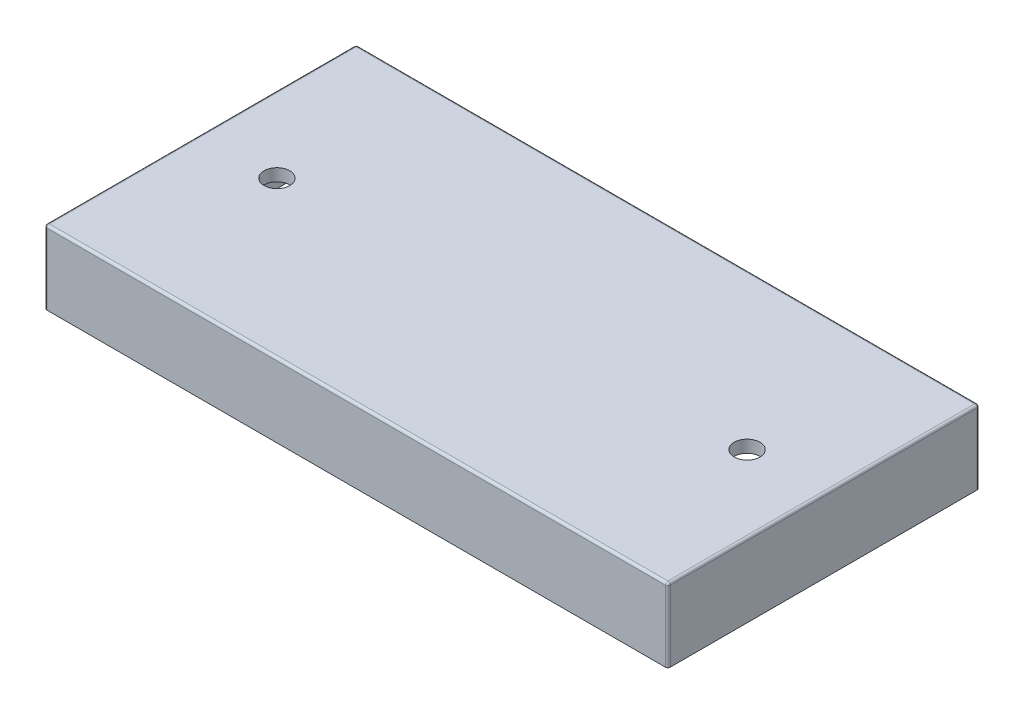
ISO-10303-21;
HEADER;
FILE_DESCRIPTION(('STEP AP214'),'2;1');
FILE_NAME('part.step','',(''),(''),'','','');
FILE_SCHEMA(('AUTOMOTIVE_DESIGN { 1 0 10303 214 1 1 1 1 }'));
ENDSEC;
DATA;
#1=APPLICATION_CONTEXT('core data for automotive mechanical design processes');
#2=APPLICATION_PROTOCOL_DEFINITION('international standard','automotive_design',2000,#1);
#3=PRODUCT_CONTEXT('',#1,'mechanical');
#4=PRODUCT('Part','Part','',(#3));
#5=PRODUCT_RELATED_PRODUCT_CATEGORY('part','',(#4));
#6=PRODUCT_DEFINITION_FORMATION('','',#4);
#7=PRODUCT_DEFINITION_CONTEXT('part definition',#1,'design');
#8=PRODUCT_DEFINITION('design','',#6,#7);
#9=PRODUCT_DEFINITION_SHAPE('','',#8);
#10=(LENGTH_UNIT() NAMED_UNIT(*) SI_UNIT(.MILLI.,.METRE.));
#11=(NAMED_UNIT(*) PLANE_ANGLE_UNIT() SI_UNIT($,.RADIAN.));
#12=(NAMED_UNIT(*) SI_UNIT($,.STERADIAN.) SOLID_ANGLE_UNIT());
#13=UNCERTAINTY_MEASURE_WITH_UNIT(LENGTH_MEASURE(1.E-05),#10,'distance_accuracy_value','');
#14=(GEOMETRIC_REPRESENTATION_CONTEXT(3) GLOBAL_UNCERTAINTY_ASSIGNED_CONTEXT((#13)) GLOBAL_UNIT_ASSIGNED_CONTEXT((#10,
#11,#12)) REPRESENTATION_CONTEXT('',''));
#15=CARTESIAN_POINT('',(0.,0.,0.));
#16=DIRECTION('',(0.,0.,1.));
#17=DIRECTION('',(1.,0.,0.));
#18=AXIS2_PLACEMENT_3D('',#15,#16,#17);
#19=CARTESIAN_POINT('',(0.,0.,0.));
#20=DIRECTION('',(0.,1.,0.));
#21=DIRECTION('',(0.,0.,1.));
#22=AXIS2_PLACEMENT_3D('',#19,#20,#21);
#23=PLANE('',#22);
#24=DIRECTION('',(-1.,0.,0.));
#25=VECTOR('',#24,1.);
#26=CARTESIAN_POINT('',(-50.9,0.,-25.45));
#27=LINE('',#26,#25);
#28=CARTESIAN_POINT('',(50.5,0.,-25.45));
#29=VERTEX_POINT('',#28);
#30=CARTESIAN_POINT('',(-50.5,0.,-25.45));
#31=VERTEX_POINT('',#30);
#32=EDGE_CURVE('E202',#29,#31,#27,.T.);
#33=ORIENTED_EDGE('',*,*,#32,.F.);
#34=CARTESIAN_POINT('',(50.5,0.,-25.05));
#35=DIRECTION('',(0.,1.,0.));
#36=DIRECTION('',(0.,0.,1.));
#37=AXIS2_PLACEMENT_3D('',#34,#35,#36);
#38=CIRCLE('',#37,0.4);
#39=CARTESIAN_POINT('',(50.9,0.,-25.05));
#40=VERTEX_POINT('',#39);
#41=EDGE_CURVE('E229',#29,#40,#38,.F.);
#42=ORIENTED_EDGE('',*,*,#41,.T.);
#43=DIRECTION('',(0.,0.,-1.));
#44=VECTOR('',#43,1.);
#45=CARTESIAN_POINT('',(50.9,0.,-25.45));
#46=LINE('',#45,#44);
#47=CARTESIAN_POINT('',(50.9,0.,25.05));
#48=VERTEX_POINT('',#47);
#49=EDGE_CURVE('E378',#48,#40,#46,.T.);
#50=ORIENTED_EDGE('',*,*,#49,.F.);
#51=CARTESIAN_POINT('',(50.5,0.,25.05));
#52=DIRECTION('',(0.,1.,0.));
#53=DIRECTION('',(0.,0.,1.));
#54=AXIS2_PLACEMENT_3D('',#51,#52,#53);
#55=CIRCLE('',#54,0.4);
#56=CARTESIAN_POINT('',(50.5,0.,25.45));
#57=VERTEX_POINT('',#56);
#58=EDGE_CURVE('E227',#48,#57,#55,.F.);
#59=ORIENTED_EDGE('',*,*,#58,.T.);
#60=DIRECTION('',(1.,0.,0.));
#61=VECTOR('',#60,1.);
#62=CARTESIAN_POINT('',(-50.9,0.,25.45));
#63=LINE('',#62,#61);
#64=CARTESIAN_POINT('',(-50.5,0.,25.45));
#65=VERTEX_POINT('',#64);
#66=EDGE_CURVE('E375',#65,#57,#63,.T.);
#67=ORIENTED_EDGE('',*,*,#66,.F.);
#68=CARTESIAN_POINT('',(-50.5,0.,25.05));
#69=DIRECTION('',(0.,1.,0.));
#70=DIRECTION('',(0.,0.,1.));
#71=AXIS2_PLACEMENT_3D('',#68,#69,#70);
#72=CIRCLE('',#71,0.4);
#73=CARTESIAN_POINT('',(-50.9,0.,25.05));
#74=VERTEX_POINT('',#73);
#75=EDGE_CURVE('E225',#65,#74,#72,.F.);
#76=ORIENTED_EDGE('',*,*,#75,.T.);
#77=DIRECTION('',(0.,0.,1.));
#78=VECTOR('',#77,1.);
#79=CARTESIAN_POINT('',(-50.9,0.,-25.45));
#80=LINE('',#79,#78);
#81=CARTESIAN_POINT('',(-50.9,0.,-25.05));
#82=VERTEX_POINT('',#81);
#83=EDGE_CURVE('E372',#82,#74,#80,.T.);
#84=ORIENTED_EDGE('',*,*,#83,.F.);
#85=CARTESIAN_POINT('',(-50.5,0.,-25.05));
#86=DIRECTION('',(0.,1.,0.));
#87=DIRECTION('',(0.,0.,1.));
#88=AXIS2_PLACEMENT_3D('',#85,#86,#87);
#89=CIRCLE('',#88,0.4);
#90=EDGE_CURVE('E223',#82,#31,#89,.F.);
#91=ORIENTED_EDGE('',*,*,#90,.T.);
#92=EDGE_LOOP('',(#33,#42,#50,#59,#67,#76,#84,#91));
#93=FACE_BOUND('',#92,.T.);
#94=DIRECTION('',(0.,0.,-1.));
#95=VECTOR('',#94,1.);
#96=CARTESIAN_POINT('',(48.9,0.,-23.45));
#97=LINE('',#96,#95);
#98=CARTESIAN_POINT('',(48.9,0.,22.45));
#99=VERTEX_POINT('',#98);
#100=CARTESIAN_POINT('',(48.9,0.,-22.45));
#101=VERTEX_POINT('',#100);
#102=EDGE_CURVE('E366',#99,#101,#97,.T.);
#103=ORIENTED_EDGE('',*,*,#102,.T.);
#104=CARTESIAN_POINT('',(47.9,0.,-22.45));
#105=DIRECTION('',(0.,1.,0.));
#106=DIRECTION('',(0.,0.,1.));
#107=AXIS2_PLACEMENT_3D('',#104,#105,#106);
#108=CIRCLE('',#107,1.);
#109=CARTESIAN_POINT('',(47.9,0.,-23.45));
#110=VERTEX_POINT('',#109);
#111=EDGE_CURVE('E11',#101,#110,#108,.T.);
#112=ORIENTED_EDGE('',*,*,#111,.T.);
#113=DIRECTION('',(-1.,0.,0.));
#114=VECTOR('',#113,1.);
#115=CARTESIAN_POINT('',(-48.9,0.,-23.45));
#116=LINE('',#115,#114);
#117=CARTESIAN_POINT('',(-47.9,0.,-23.45));
#118=VERTEX_POINT('',#117);
#119=EDGE_CURVE('E267',#110,#118,#116,.T.);
#120=ORIENTED_EDGE('',*,*,#119,.T.);
#121=CARTESIAN_POINT('',(-47.9,0.,-22.45));
#122=DIRECTION('',(0.,1.,0.));
#123=DIRECTION('',(0.,0.,1.));
#124=AXIS2_PLACEMENT_3D('',#121,#122,#123);
#125=CIRCLE('',#124,1.);
#126=CARTESIAN_POINT('',(-48.9,0.,-22.45));
#127=VERTEX_POINT('',#126);
#128=EDGE_CURVE('E43',#118,#127,#125,.T.);
#129=ORIENTED_EDGE('',*,*,#128,.T.);
#130=DIRECTION('',(0.,0.,1.));
#131=VECTOR('',#130,1.);
#132=CARTESIAN_POINT('',(-48.9,0.,-23.45));
#133=LINE('',#132,#131);
#134=CARTESIAN_POINT('',(-48.9,0.,22.45));
#135=VERTEX_POINT('',#134);
#136=EDGE_CURVE('E357',#127,#135,#133,.T.);
#137=ORIENTED_EDGE('',*,*,#136,.T.);
#138=CARTESIAN_POINT('',(-47.9,0.,22.45));
#139=DIRECTION('',(0.,1.,0.));
#140=DIRECTION('',(0.,0.,1.));
#141=AXIS2_PLACEMENT_3D('',#138,#139,#140);
#142=CIRCLE('',#141,1.);
#143=CARTESIAN_POINT('',(-47.9,0.,23.45));
#144=VERTEX_POINT('',#143);
#145=EDGE_CURVE('E301',#135,#144,#142,.T.);
#146=ORIENTED_EDGE('',*,*,#145,.T.);
#147=DIRECTION('',(1.,0.,0.));
#148=VECTOR('',#147,1.);
#149=CARTESIAN_POINT('',(-48.9,0.,23.45));
#150=LINE('',#149,#148);
#151=CARTESIAN_POINT('',(47.9,0.,23.45));
#152=VERTEX_POINT('',#151);
#153=EDGE_CURVE('E364',#144,#152,#150,.T.);
#154=ORIENTED_EDGE('',*,*,#153,.T.);
#155=CARTESIAN_POINT('',(47.9,0.,22.45));
#156=DIRECTION('',(0.,1.,0.));
#157=DIRECTION('',(0.,0.,1.));
#158=AXIS2_PLACEMENT_3D('',#155,#156,#157);
#159=CIRCLE('',#158,1.);
#160=EDGE_CURVE('E299',#152,#99,#159,.T.);
#161=ORIENTED_EDGE('',*,*,#160,.T.);
#162=EDGE_LOOP('',(#103,#112,#120,#129,#137,#146,#154,#161));
#163=FACE_BOUND('',#162,.T.);
#164=ADVANCED_FACE('F34',(#93,#163),#23,.F.);
#165=CARTESIAN_POINT('',(-50.9,10.,-25.45));
#166=DIRECTION('',(1.,0.,0.));
#167=DIRECTION('',(0.,0.,-1.));
#168=AXIS2_PLACEMENT_3D('',#165,#166,#167);
#169=PLANE('',#168);
#170=ORIENTED_EDGE('',*,*,#83,.T.);
#171=DIRECTION('',(0.,-1.,0.));
#172=VECTOR('',#171,1.);
#173=CARTESIAN_POINT('',(-50.9,10.,25.05));
#174=LINE('',#173,#172);
#175=CARTESIAN_POINT('',(-50.9,11.6,25.05));
#176=VERTEX_POINT('',#175);
#177=EDGE_CURVE('E215',#74,#176,#174,.F.);
#178=ORIENTED_EDGE('',*,*,#177,.T.);
#179=DIRECTION('',(0.,0.,1.));
#180=VECTOR('',#179,1.);
#181=CARTESIAN_POINT('',(-50.9,11.6,-25.45));
#182=LINE('',#181,#180);
#183=CARTESIAN_POINT('',(-50.9,11.6,-25.05));
#184=VERTEX_POINT('',#183);
#185=EDGE_CURVE('E179',#176,#184,#182,.F.);
#186=ORIENTED_EDGE('',*,*,#185,.T.);
#187=DIRECTION('',(0.,-1.,0.));
#188=VECTOR('',#187,1.);
#189=CARTESIAN_POINT('',(-50.9,10.,-25.05));
#190=LINE('',#189,#188);
#191=EDGE_CURVE('E209',#184,#82,#190,.T.);
#192=ORIENTED_EDGE('',*,*,#191,.T.);
#193=EDGE_LOOP('',(#170,#178,#186,#192));
#194=FACE_BOUND('',#193,.T.);
#195=ADVANCED_FACE('F431',(#194),#169,.F.);
#196=CARTESIAN_POINT('',(-50.9,10.,25.45));
#197=DIRECTION('',(0.,0.,-1.));
#198=DIRECTION('',(-1.,0.,0.));
#199=AXIS2_PLACEMENT_3D('',#196,#197,#198);
#200=PLANE('',#199);
#201=ORIENTED_EDGE('',*,*,#66,.T.);
#202=DIRECTION('',(0.,-1.,0.));
#203=VECTOR('',#202,1.);
#204=CARTESIAN_POINT('',(50.5,10.,25.45));
#205=LINE('',#204,#203);
#206=CARTESIAN_POINT('',(50.5,11.6,25.45));
#207=VERTEX_POINT('',#206);
#208=EDGE_CURVE('E241',#57,#207,#205,.F.);
#209=ORIENTED_EDGE('',*,*,#208,.T.);
#210=DIRECTION('',(1.,0.,0.));
#211=VECTOR('',#210,1.);
#212=CARTESIAN_POINT('',(-50.9,11.6,25.45));
#213=LINE('',#212,#211);
#214=CARTESIAN_POINT('',(-50.5,11.6,25.45));
#215=VERTEX_POINT('',#214);
#216=EDGE_CURVE('E239',#207,#215,#213,.F.);
#217=ORIENTED_EDGE('',*,*,#216,.T.);
#218=DIRECTION('',(0.,-1.,0.));
#219=VECTOR('',#218,1.);
#220=CARTESIAN_POINT('',(-50.5,10.,25.45));
#221=LINE('',#220,#219);
#222=EDGE_CURVE('E237',#215,#65,#221,.T.);
#223=ORIENTED_EDGE('',*,*,#222,.T.);
#224=EDGE_LOOP('',(#201,#209,#217,#223));
#225=FACE_BOUND('',#224,.T.);
#226=ADVANCED_FACE('F424',(#225),#200,.F.);
#227=CARTESIAN_POINT('',(50.9,10.,-25.45));
#228=DIRECTION('',(-1.,0.,0.));
#229=DIRECTION('',(0.,0.,1.));
#230=AXIS2_PLACEMENT_3D('',#227,#228,#229);
#231=PLANE('',#230);
#232=ORIENTED_EDGE('',*,*,#49,.T.);
#233=DIRECTION('',(0.,-1.,0.));
#234=VECTOR('',#233,1.);
#235=CARTESIAN_POINT('',(50.9,10.,-25.05));
#236=LINE('',#235,#234);
#237=CARTESIAN_POINT('',(50.9,11.6,-25.05));
#238=VERTEX_POINT('',#237);
#239=EDGE_CURVE('E235',#40,#238,#236,.F.);
#240=ORIENTED_EDGE('',*,*,#239,.T.);
#241=DIRECTION('',(0.,0.,-1.));
#242=VECTOR('',#241,1.);
#243=CARTESIAN_POINT('',(50.9,11.6,25.45));
#244=LINE('',#243,#242);
#245=CARTESIAN_POINT('',(50.9,11.6,25.05));
#246=VERTEX_POINT('',#245);
#247=EDGE_CURVE('E231',#238,#246,#244,.F.);
#248=ORIENTED_EDGE('',*,*,#247,.T.);
#249=DIRECTION('',(0.,-1.,0.));
#250=VECTOR('',#249,1.);
#251=CARTESIAN_POINT('',(50.9,10.,25.05));
#252=LINE('',#251,#250);
#253=EDGE_CURVE('E233',#246,#48,#252,.T.);
#254=ORIENTED_EDGE('',*,*,#253,.T.);
#255=EDGE_LOOP('',(#232,#240,#248,#254));
#256=FACE_BOUND('',#255,.T.);
#257=ADVANCED_FACE('F414',(#256),#231,.F.);
#258=CARTESIAN_POINT('',(-50.9,10.,-25.45));
#259=DIRECTION('',(0.,0.,1.));
#260=DIRECTION('',(1.,0.,0.));
#261=AXIS2_PLACEMENT_3D('',#258,#259,#260);
#262=PLANE('',#261);
#263=DIRECTION('',(-1.,0.,0.));
#264=VECTOR('',#263,1.);
#265=CARTESIAN_POINT('',(50.9,11.6,-25.45));
#266=LINE('',#265,#264);
#267=CARTESIAN_POINT('',(-50.5,11.6,-25.45));
#268=VERTEX_POINT('',#267);
#269=CARTESIAN_POINT('',(50.5,11.6,-25.45));
#270=VERTEX_POINT('',#269);
#271=EDGE_CURVE('E219',#268,#270,#266,.F.);
#272=ORIENTED_EDGE('',*,*,#271,.T.);
#273=DIRECTION('',(0.,-1.,0.));
#274=VECTOR('',#273,1.);
#275=CARTESIAN_POINT('',(50.5,10.,-25.45));
#276=LINE('',#275,#274);
#277=EDGE_CURVE('E221',#270,#29,#276,.T.);
#278=ORIENTED_EDGE('',*,*,#277,.T.);
#279=ORIENTED_EDGE('',*,*,#32,.T.);
#280=DIRECTION('',(0.,-1.,0.));
#281=VECTOR('',#280,1.);
#282=CARTESIAN_POINT('',(-50.5,10.,-25.45));
#283=LINE('',#282,#281);
#284=EDGE_CURVE('E217',#31,#268,#283,.F.);
#285=ORIENTED_EDGE('',*,*,#284,.T.);
#286=EDGE_LOOP('',(#272,#278,#279,#285));
#287=FACE_BOUND('',#286,.T.);
#288=ADVANCED_FACE('F385',(#287),#262,.F.);
#289=CARTESIAN_POINT('',(-48.9,10.,-23.45));
#290=DIRECTION('',(0.,0.,1.));
#291=DIRECTION('',(1.,0.,0.));
#292=AXIS2_PLACEMENT_3D('',#289,#290,#291);
#293=PLANE('',#292);
#294=DIRECTION('',(-1.,0.,0.));
#295=VECTOR('',#294,1.);
#296=CARTESIAN_POINT('',(-48.9,9.,-23.45));
#297=LINE('',#296,#295);
#298=CARTESIAN_POINT('',(47.9,9.,-23.45));
#299=VERTEX_POINT('',#298);
#300=CARTESIAN_POINT('',(-47.9,9.,-23.45));
#301=VERTEX_POINT('',#300);
#302=EDGE_CURVE('E291',#299,#301,#297,.T.);
#303=ORIENTED_EDGE('',*,*,#302,.T.);
#304=DIRECTION('',(0.,-1.,0.));
#305=VECTOR('',#304,1.);
#306=CARTESIAN_POINT('',(-47.9,0.,-23.45));
#307=LINE('',#306,#305);
#308=EDGE_CURVE('E293',#301,#118,#307,.T.);
#309=ORIENTED_EDGE('',*,*,#308,.T.);
#310=ORIENTED_EDGE('',*,*,#119,.F.);
#311=DIRECTION('',(0.,-1.,0.));
#312=VECTOR('',#311,1.);
#313=CARTESIAN_POINT('',(47.9,10.,-23.45));
#314=LINE('',#313,#312);
#315=EDGE_CURVE('E289',#110,#299,#314,.F.);
#316=ORIENTED_EDGE('',*,*,#315,.T.);
#317=EDGE_LOOP('',(#303,#309,#310,#316));
#318=FACE_BOUND('',#317,.T.);
#319=ADVANCED_FACE('F513',(#318),#293,.T.);
#320=CARTESIAN_POINT('',(-48.9,10.,-23.45));
#321=DIRECTION('',(1.,0.,0.));
#322=DIRECTION('',(0.,0.,-1.));
#323=AXIS2_PLACEMENT_3D('',#320,#321,#322);
#324=PLANE('',#323);
#325=DIRECTION('',(0.,0.,1.));
#326=VECTOR('',#325,1.);
#327=CARTESIAN_POINT('',(-48.9,9.,-23.45));
#328=LINE('',#327,#326);
#329=CARTESIAN_POINT('',(-48.9,9.,-22.45));
#330=VERTEX_POINT('',#329);
#331=CARTESIAN_POINT('',(-48.9,9.,22.45));
#332=VERTEX_POINT('',#331);
#333=EDGE_CURVE('E51',#330,#332,#328,.T.);
#334=ORIENTED_EDGE('',*,*,#333,.T.);
#335=DIRECTION('',(0.,-1.,0.));
#336=VECTOR('',#335,1.);
#337=CARTESIAN_POINT('',(-48.9,0.,22.45));
#338=LINE('',#337,#336);
#339=EDGE_CURVE('E297',#332,#135,#338,.T.);
#340=ORIENTED_EDGE('',*,*,#339,.T.);
#341=ORIENTED_EDGE('',*,*,#136,.F.);
#342=DIRECTION('',(0.,-1.,0.));
#343=VECTOR('',#342,1.);
#344=CARTESIAN_POINT('',(-48.9,10.,-22.45));
#345=LINE('',#344,#343);
#346=EDGE_CURVE('E56',#127,#330,#345,.F.);
#347=ORIENTED_EDGE('',*,*,#346,.T.);
#348=EDGE_LOOP('',(#334,#340,#341,#347));
#349=FACE_BOUND('',#348,.T.);
#350=ADVANCED_FACE('F356',(#349),#324,.T.);
#351=CARTESIAN_POINT('',(-48.9,10.,23.45));
#352=DIRECTION('',(0.,0.,-1.));
#353=DIRECTION('',(-1.,0.,0.));
#354=AXIS2_PLACEMENT_3D('',#351,#352,#353);
#355=PLANE('',#354);
#356=DIRECTION('',(1.,0.,0.));
#357=VECTOR('',#356,1.);
#358=CARTESIAN_POINT('',(-48.9,9.,23.45));
#359=LINE('',#358,#357);
#360=CARTESIAN_POINT('',(-47.9,9.,23.45));
#361=VERTEX_POINT('',#360);
#362=CARTESIAN_POINT('',(47.9,9.,23.45));
#363=VERTEX_POINT('',#362);
#364=EDGE_CURVE('E269',#361,#363,#359,.T.);
#365=ORIENTED_EDGE('',*,*,#364,.T.);
#366=DIRECTION('',(0.,-1.,0.));
#367=VECTOR('',#366,1.);
#368=CARTESIAN_POINT('',(47.9,0.,23.45));
#369=LINE('',#368,#367);
#370=EDGE_CURVE('E272',#363,#152,#369,.T.);
#371=ORIENTED_EDGE('',*,*,#370,.T.);
#372=ORIENTED_EDGE('',*,*,#153,.F.);
#373=DIRECTION('',(0.,-1.,0.));
#374=VECTOR('',#373,1.);
#375=CARTESIAN_POINT('',(-47.9,10.,23.45));
#376=LINE('',#375,#374);
#377=EDGE_CURVE('E242',#144,#361,#376,.F.);
#378=ORIENTED_EDGE('',*,*,#377,.T.);
#379=EDGE_LOOP('',(#365,#371,#372,#378));
#380=FACE_BOUND('',#379,.T.);
#381=ADVANCED_FACE('F529',(#380),#355,.T.);
#382=CARTESIAN_POINT('',(48.9,10.,-23.45));
#383=DIRECTION('',(-1.,0.,0.));
#384=DIRECTION('',(0.,0.,1.));
#385=AXIS2_PLACEMENT_3D('',#382,#383,#384);
#386=PLANE('',#385);
#387=ORIENTED_EDGE('',*,*,#102,.F.);
#388=DIRECTION('',(0.,-1.,0.));
#389=VECTOR('',#388,1.);
#390=CARTESIAN_POINT('',(48.9,10.,22.45));
#391=LINE('',#390,#389);
#392=CARTESIAN_POINT('',(48.9,9.,22.45));
#393=VERTEX_POINT('',#392);
#394=EDGE_CURVE('E287',#99,#393,#391,.F.);
#395=ORIENTED_EDGE('',*,*,#394,.T.);
#396=DIRECTION('',(0.,0.,-1.));
#397=VECTOR('',#396,1.);
#398=CARTESIAN_POINT('',(48.9,9.,-23.45));
#399=LINE('',#398,#397);
#400=CARTESIAN_POINT('',(48.9,9.,-22.45));
#401=VERTEX_POINT('',#400);
#402=EDGE_CURVE('E285',#393,#401,#399,.T.);
#403=ORIENTED_EDGE('',*,*,#402,.T.);
#404=DIRECTION('',(0.,-1.,0.));
#405=VECTOR('',#404,1.);
#406=CARTESIAN_POINT('',(48.9,0.,-22.45));
#407=LINE('',#406,#405);
#408=EDGE_CURVE('E283',#401,#101,#407,.T.);
#409=ORIENTED_EDGE('',*,*,#408,.T.);
#410=EDGE_LOOP('',(#387,#395,#403,#409));
#411=FACE_BOUND('',#410,.T.);
#412=ADVANCED_FACE('F531',(#411),#386,.T.);
#413=CARTESIAN_POINT('',(0.,10.,0.));
#414=DIRECTION('',(0.,1.,0.));
#415=DIRECTION('',(0.,0.,1.));
#416=AXIS2_PLACEMENT_3D('',#413,#414,#415);
#417=PLANE('',#416);
#418=CARTESIAN_POINT('',(-38.4,10.,0.));
#419=DIRECTION('',(0.,1.,0.));
#420=DIRECTION('',(0.,0.,1.));
#421=AXIS2_PLACEMENT_3D('',#418,#419,#420);
#422=CIRCLE('',#421,2.1);
#423=CARTESIAN_POINT('',(-38.4,10.,2.1));
#424=VERTEX_POINT('',#423);
#425=EDGE_CURVE('E307',#424,#424,#422,.F.);
#426=ORIENTED_EDGE('',*,*,#425,.F.);
#427=EDGE_LOOP('',(#426));
#428=FACE_BOUND('',#427,.T.);
#429=CARTESIAN_POINT('',(38.4,10.,0.));
#430=DIRECTION('',(0.,1.,0.));
#431=DIRECTION('',(0.,0.,1.));
#432=AXIS2_PLACEMENT_3D('',#429,#430,#431);
#433=CIRCLE('',#432,2.1);
#434=CARTESIAN_POINT('',(38.4,10.,2.09999999999999));
#435=VERTEX_POINT('',#434);
#436=EDGE_CURVE('E692',#435,#435,#433,.F.);
#437=ORIENTED_EDGE('',*,*,#436,.F.);
#438=EDGE_LOOP('',(#437));
#439=FACE_BOUND('',#438,.T.);
#440=DIRECTION('',(0.,0.,-1.));
#441=VECTOR('',#440,1.);
#442=CARTESIAN_POINT('',(47.9,10.,0.));
#443=LINE('',#442,#441);
#444=CARTESIAN_POINT('',(47.9,10.,-22.45));
#445=VERTEX_POINT('',#444);
#446=CARTESIAN_POINT('',(47.9,10.,22.45));
#447=VERTEX_POINT('',#446);
#448=EDGE_CURVE('E278',#445,#447,#443,.F.);
#449=ORIENTED_EDGE('',*,*,#448,.T.);
#450=DIRECTION('',(1.,0.,0.));
#451=VECTOR('',#450,1.);
#452=CARTESIAN_POINT('',(0.,10.,22.45));
#453=LINE('',#452,#451);
#454=CARTESIAN_POINT('',(-47.9,10.,22.45));
#455=VERTEX_POINT('',#454);
#456=EDGE_CURVE('E280',#447,#455,#453,.F.);
#457=ORIENTED_EDGE('',*,*,#456,.T.);
#458=DIRECTION('',(0.,0.,1.));
#459=VECTOR('',#458,1.);
#460=CARTESIAN_POINT('',(-47.9,10.,0.));
#461=LINE('',#460,#459);
#462=CARTESIAN_POINT('',(-47.9,10.,-22.45));
#463=VERTEX_POINT('',#462);
#464=EDGE_CURVE('E274',#455,#463,#461,.F.);
#465=ORIENTED_EDGE('',*,*,#464,.T.);
#466=DIRECTION('',(-1.,0.,0.));
#467=VECTOR('',#466,1.);
#468=CARTESIAN_POINT('',(0.,10.,-22.45));
#469=LINE('',#468,#467);
#470=EDGE_CURVE('E276',#463,#445,#469,.F.);
#471=ORIENTED_EDGE('',*,*,#470,.T.);
#472=EDGE_LOOP('',(#449,#457,#465,#471));
#473=FACE_BOUND('',#472,.T.);
#474=ADVANCED_FACE('F522',(#428,#439,#473),#417,.F.);
#475=CARTESIAN_POINT('',(0.,12.,0.));
#476=DIRECTION('',(0.,1.,0.));
#477=DIRECTION('',(0.,0.,1.));
#478=AXIS2_PLACEMENT_3D('',#475,#476,#477);
#479=PLANE('',#478);
#480=CARTESIAN_POINT('',(-38.4,12.,0.));
#481=DIRECTION('',(0.,1.,0.));
#482=DIRECTION('',(0.,0.,1.));
#483=AXIS2_PLACEMENT_3D('',#480,#481,#482);
#484=CIRCLE('',#483,2.1);
#485=CARTESIAN_POINT('',(-38.4,12.,2.1));
#486=VERTEX_POINT('',#485);
#487=EDGE_CURVE('E688',#486,#486,#484,.T.);
#488=ORIENTED_EDGE('',*,*,#487,.F.);
#489=EDGE_LOOP('',(#488));
#490=FACE_BOUND('',#489,.T.);
#491=CARTESIAN_POINT('',(38.4,12.,0.));
#492=DIRECTION('',(0.,1.,0.));
#493=DIRECTION('',(0.,0.,-1.));
#494=AXIS2_PLACEMENT_3D('',#491,#492,#493);
#495=CIRCLE('',#494,2.1);
#496=CARTESIAN_POINT('',(38.4,12.,-2.1));
#497=VERTEX_POINT('',#496);
#498=EDGE_CURVE('E695',#497,#497,#495,.T.);
#499=ORIENTED_EDGE('',*,*,#498,.F.);
#500=EDGE_LOOP('',(#499));
#501=FACE_BOUND('',#500,.T.);
#502=DIRECTION('',(0.,0.,-1.));
#503=VECTOR('',#502,1.);
#504=CARTESIAN_POINT('',(50.5,12.,-25.45));
#505=LINE('',#504,#503);
#506=CARTESIAN_POINT('',(50.5,12.,25.05));
#507=VERTEX_POINT('',#506);
#508=CARTESIAN_POINT('',(50.5,12.,-25.05));
#509=VERTEX_POINT('',#508);
#510=EDGE_CURVE('E201',#507,#509,#505,.T.);
#511=ORIENTED_EDGE('',*,*,#510,.T.);
#512=DIRECTION('',(-1.,0.,0.));
#513=VECTOR('',#512,1.);
#514=CARTESIAN_POINT('',(-50.9,12.,-25.05));
#515=LINE('',#514,#513);
#516=CARTESIAN_POINT('',(-50.5,12.,-25.05));
#517=VERTEX_POINT('',#516);
#518=EDGE_CURVE('E206',#509,#517,#515,.T.);
#519=ORIENTED_EDGE('',*,*,#518,.T.);
#520=DIRECTION('',(0.,0.,1.));
#521=VECTOR('',#520,1.);
#522=CARTESIAN_POINT('',(-50.5,12.,25.45));
#523=LINE('',#522,#521);
#524=CARTESIAN_POINT('',(-50.5,12.,25.05));
#525=VERTEX_POINT('',#524);
#526=EDGE_CURVE('E177',#517,#525,#523,.T.);
#527=ORIENTED_EDGE('',*,*,#526,.T.);
#528=DIRECTION('',(1.,0.,0.));
#529=VECTOR('',#528,1.);
#530=CARTESIAN_POINT('',(50.9,12.,25.05));
#531=LINE('',#530,#529);
#532=EDGE_CURVE('E195',#525,#507,#531,.T.);
#533=ORIENTED_EDGE('',*,*,#532,.T.);
#534=EDGE_LOOP('',(#511,#519,#527,#533));
#535=FACE_BOUND('',#534,.T.);
#536=ADVANCED_FACE('F204',(#490,#501,#535),#479,.T.);
#537=CARTESIAN_POINT('',(50.5,10.,-25.05));
#538=DIRECTION('',(0.,-1.,0.));
#539=DIRECTION('',(0.,0.,-1.));
#540=AXIS2_PLACEMENT_3D('',#537,#538,#539);
#541=CYLINDRICAL_SURFACE('',#540,0.4);
#542=ORIENTED_EDGE('',*,*,#41,.F.);
#543=ORIENTED_EDGE('',*,*,#277,.F.);
#544=CARTESIAN_POINT('',(50.5,11.6,-25.05));
#545=DIRECTION('',(0.,1.,0.));
#546=DIRECTION('',(0.,0.,1.));
#547=AXIS2_PLACEMENT_3D('',#544,#545,#546);
#548=CIRCLE('',#547,0.4);
#549=EDGE_CURVE('E264',#238,#270,#548,.T.);
#550=ORIENTED_EDGE('',*,*,#549,.F.);
#551=ORIENTED_EDGE('',*,*,#239,.F.);
#552=EDGE_LOOP('',(#542,#543,#550,#551));
#553=FACE_BOUND('',#552,.T.);
#554=ADVANCED_FACE('F403',(#553),#541,.T.);
#555=CARTESIAN_POINT('',(50.5,11.6,0.));
#556=DIRECTION('',(0.,0.,1.));
#557=DIRECTION('',(1.,0.,0.));
#558=AXIS2_PLACEMENT_3D('',#555,#556,#557);
#559=CYLINDRICAL_SURFACE('',#558,0.4);
#560=CARTESIAN_POINT('',(50.5,11.6,25.05));
#561=DIRECTION('',(0.,0.,1.));
#562=DIRECTION('',(0.,-1.,0.));
#563=AXIS2_PLACEMENT_3D('',#560,#561,#562);
#564=CIRCLE('',#563,0.4);
#565=EDGE_CURVE('E258',#246,#507,#564,.T.);
#566=ORIENTED_EDGE('',*,*,#565,.F.);
#567=ORIENTED_EDGE('',*,*,#247,.F.);
#568=CARTESIAN_POINT('',(50.5,11.6,-25.05));
#569=DIRECTION('',(0.,0.,-1.));
#570=DIRECTION('',(-1.,0.,0.));
#571=AXIS2_PLACEMENT_3D('',#568,#569,#570);
#572=CIRCLE('',#571,0.4);
#573=EDGE_CURVE('E261',#509,#238,#572,.T.);
#574=ORIENTED_EDGE('',*,*,#573,.F.);
#575=ORIENTED_EDGE('',*,*,#510,.F.);
#576=EDGE_LOOP('',(#566,#567,#574,#575));
#577=FACE_BOUND('',#576,.T.);
#578=ADVANCED_FACE('F411',(#577),#559,.T.);
#579=CARTESIAN_POINT('',(50.5,10.,25.05));
#580=DIRECTION('',(0.,-1.,0.));
#581=DIRECTION('',(0.,0.,-1.));
#582=AXIS2_PLACEMENT_3D('',#579,#580,#581);
#583=CYLINDRICAL_SURFACE('',#582,0.4);
#584=ORIENTED_EDGE('',*,*,#58,.F.);
#585=ORIENTED_EDGE('',*,*,#253,.F.);
#586=CARTESIAN_POINT('',(50.5,11.6,25.05));
#587=DIRECTION('',(0.,1.,0.));
#588=DIRECTION('',(0.,0.,1.));
#589=AXIS2_PLACEMENT_3D('',#586,#587,#588);
#590=CIRCLE('',#589,0.4);
#591=EDGE_CURVE('E255',#207,#246,#590,.T.);
#592=ORIENTED_EDGE('',*,*,#591,.F.);
#593=ORIENTED_EDGE('',*,*,#208,.F.);
#594=EDGE_LOOP('',(#584,#585,#592,#593));
#595=FACE_BOUND('',#594,.T.);
#596=ADVANCED_FACE('F419',(#595),#583,.T.);
#597=CARTESIAN_POINT('',(50.5,11.6,-25.05));
#598=DIRECTION('',(0.,0.,1.));
#599=DIRECTION('',(1.,0.,0.));
#600=AXIS2_PLACEMENT_3D('',#597,#598,#599);
#601=SPHERICAL_SURFACE('',#600,0.4);
#602=ORIENTED_EDGE('',*,*,#573,.T.);
#603=ORIENTED_EDGE('',*,*,#549,.T.);
#604=CARTESIAN_POINT('',(50.5,11.6,-25.05));
#605=DIRECTION('',(1.,0.,0.));
#606=DIRECTION('',(0.,0.,-1.));
#607=AXIS2_PLACEMENT_3D('',#604,#605,#606);
#608=CIRCLE('',#607,0.4);
#609=EDGE_CURVE('E252',#509,#270,#608,.F.);
#610=ORIENTED_EDGE('',*,*,#609,.F.);
#611=EDGE_LOOP('',(#602,#603,#610));
#612=FACE_BOUND('',#611,.T.);
#613=ADVANCED_FACE('F406',(#612),#601,.T.);
#614=CARTESIAN_POINT('',(50.5,11.6,25.05));
#615=DIRECTION('',(0.,0.,1.));
#616=DIRECTION('',(1.,0.,0.));
#617=AXIS2_PLACEMENT_3D('',#614,#615,#616);
#618=SPHERICAL_SURFACE('',#617,0.4);
#619=ORIENTED_EDGE('',*,*,#591,.T.);
#620=ORIENTED_EDGE('',*,*,#565,.T.);
#621=CARTESIAN_POINT('',(50.5,11.6,25.05));
#622=DIRECTION('',(1.,0.,0.));
#623=DIRECTION('',(0.,0.,-1.));
#624=AXIS2_PLACEMENT_3D('',#621,#622,#623);
#625=CIRCLE('',#624,0.4);
#626=EDGE_CURVE('E198',#207,#507,#625,.F.);
#627=ORIENTED_EDGE('',*,*,#626,.F.);
#628=EDGE_LOOP('',(#619,#620,#627));
#629=FACE_BOUND('',#628,.T.);
#630=ADVANCED_FACE('F456',(#629),#618,.T.);
#631=CARTESIAN_POINT('',(-50.5,10.,-25.05));
#632=DIRECTION('',(0.,-1.,0.));
#633=DIRECTION('',(0.,0.,-1.));
#634=AXIS2_PLACEMENT_3D('',#631,#632,#633);
#635=CYLINDRICAL_SURFACE('',#634,0.4);
#636=ORIENTED_EDGE('',*,*,#90,.F.);
#637=ORIENTED_EDGE('',*,*,#191,.F.);
#638=CARTESIAN_POINT('',(-50.5,11.6,-25.05));
#639=DIRECTION('',(0.,1.,0.));
#640=DIRECTION('',(0.,0.,1.));
#641=AXIS2_PLACEMENT_3D('',#638,#639,#640);
#642=CIRCLE('',#641,0.4);
#643=EDGE_CURVE('E248',#268,#184,#642,.T.);
#644=ORIENTED_EDGE('',*,*,#643,.F.);
#645=ORIENTED_EDGE('',*,*,#284,.F.);
#646=EDGE_LOOP('',(#636,#637,#644,#645));
#647=FACE_BOUND('',#646,.T.);
#648=ADVANCED_FACE('F393',(#647),#635,.T.);
#649=CARTESIAN_POINT('',(0.,11.6,-25.05));
#650=DIRECTION('',(1.,0.,0.));
#651=DIRECTION('',(0.,0.,-1.));
#652=AXIS2_PLACEMENT_3D('',#649,#650,#651);
#653=CYLINDRICAL_SURFACE('',#652,0.4);
#654=ORIENTED_EDGE('',*,*,#609,.T.);
#655=ORIENTED_EDGE('',*,*,#271,.F.);
#656=CARTESIAN_POINT('',(-50.5,11.6,-25.05));
#657=DIRECTION('',(-1.,0.,0.));
#658=DIRECTION('',(0.,0.,1.));
#659=AXIS2_PLACEMENT_3D('',#656,#657,#658);
#660=CIRCLE('',#659,0.4);
#661=EDGE_CURVE('E192',#517,#268,#660,.T.);
#662=ORIENTED_EDGE('',*,*,#661,.F.);
#663=ORIENTED_EDGE('',*,*,#518,.F.);
#664=EDGE_LOOP('',(#654,#655,#662,#663));
#665=FACE_BOUND('',#664,.T.);
#666=ADVANCED_FACE('F399',(#665),#653,.T.);
#667=CARTESIAN_POINT('',(0.,11.6,25.05));
#668=DIRECTION('',(-1.,0.,0.));
#669=DIRECTION('',(0.,0.,1.));
#670=AXIS2_PLACEMENT_3D('',#667,#668,#669);
#671=CYLINDRICAL_SURFACE('',#670,0.4);
#672=ORIENTED_EDGE('',*,*,#626,.T.);
#673=ORIENTED_EDGE('',*,*,#532,.F.);
#674=CARTESIAN_POINT('',(-50.5,11.6,25.05));
#675=DIRECTION('',(-1.,0.,0.));
#676=DIRECTION('',(0.,0.,1.));
#677=AXIS2_PLACEMENT_3D('',#674,#675,#676);
#678=CIRCLE('',#677,0.4);
#679=EDGE_CURVE('E185',#215,#525,#678,.T.);
#680=ORIENTED_EDGE('',*,*,#679,.F.);
#681=ORIENTED_EDGE('',*,*,#216,.F.);
#682=EDGE_LOOP('',(#672,#673,#680,#681));
#683=FACE_BOUND('',#682,.T.);
#684=ADVANCED_FACE('F196',(#683),#671,.T.);
#685=CARTESIAN_POINT('',(-50.5,10.,25.05));
#686=DIRECTION('',(0.,-1.,0.));
#687=DIRECTION('',(0.,0.,-1.));
#688=AXIS2_PLACEMENT_3D('',#685,#686,#687);
#689=CYLINDRICAL_SURFACE('',#688,0.4);
#690=ORIENTED_EDGE('',*,*,#75,.F.);
#691=ORIENTED_EDGE('',*,*,#222,.F.);
#692=CARTESIAN_POINT('',(-50.5,11.6,25.05));
#693=DIRECTION('',(0.,1.,0.));
#694=DIRECTION('',(0.,0.,1.));
#695=AXIS2_PLACEMENT_3D('',#692,#693,#694);
#696=CIRCLE('',#695,0.4);
#697=EDGE_CURVE('E189',#176,#215,#696,.T.);
#698=ORIENTED_EDGE('',*,*,#697,.F.);
#699=ORIENTED_EDGE('',*,*,#177,.F.);
#700=EDGE_LOOP('',(#690,#691,#698,#699));
#701=FACE_BOUND('',#700,.T.);
#702=ADVANCED_FACE('F427',(#701),#689,.T.);
#703=CARTESIAN_POINT('',(-50.5,11.6,-25.05));
#704=DIRECTION('',(0.,0.,1.));
#705=DIRECTION('',(1.,0.,0.));
#706=AXIS2_PLACEMENT_3D('',#703,#704,#705);
#707=SPHERICAL_SURFACE('',#706,0.4);
#708=ORIENTED_EDGE('',*,*,#661,.T.);
#709=ORIENTED_EDGE('',*,*,#643,.T.);
#710=CARTESIAN_POINT('',(-50.5,11.6,-25.05));
#711=DIRECTION('',(0.,0.,-1.));
#712=DIRECTION('',(-1.,0.,0.));
#713=AXIS2_PLACEMENT_3D('',#710,#711,#712);
#714=CIRCLE('',#713,0.4);
#715=EDGE_CURVE('E182',#517,#184,#714,.F.);
#716=ORIENTED_EDGE('',*,*,#715,.F.);
#717=EDGE_LOOP('',(#708,#709,#716));
#718=FACE_BOUND('',#717,.T.);
#719=ADVANCED_FACE('F397',(#718),#707,.T.);
#720=CARTESIAN_POINT('',(-50.5,11.6,25.05));
#721=DIRECTION('',(0.,0.,1.));
#722=DIRECTION('',(1.,0.,0.));
#723=AXIS2_PLACEMENT_3D('',#720,#721,#722);
#724=SPHERICAL_SURFACE('',#723,0.4);
#725=ORIENTED_EDGE('',*,*,#697,.T.);
#726=ORIENTED_EDGE('',*,*,#679,.T.);
#727=CARTESIAN_POINT('',(-50.5,11.6,25.05));
#728=DIRECTION('',(0.,0.,1.));
#729=DIRECTION('',(1.,0.,0.));
#730=AXIS2_PLACEMENT_3D('',#727,#728,#729);
#731=CIRCLE('',#730,0.4);
#732=EDGE_CURVE('E173',#176,#525,#731,.F.);
#733=ORIENTED_EDGE('',*,*,#732,.F.);
#734=EDGE_LOOP('',(#725,#726,#733));
#735=FACE_BOUND('',#734,.T.);
#736=ADVANCED_FACE('F187',(#735),#724,.T.);
#737=CARTESIAN_POINT('',(-50.5,11.6,0.));
#738=DIRECTION('',(0.,0.,-1.));
#739=DIRECTION('',(-1.,0.,0.));
#740=AXIS2_PLACEMENT_3D('',#737,#738,#739);
#741=CYLINDRICAL_SURFACE('',#740,0.4);
#742=ORIENTED_EDGE('',*,*,#715,.T.);
#743=ORIENTED_EDGE('',*,*,#185,.F.);
#744=ORIENTED_EDGE('',*,*,#732,.T.);
#745=ORIENTED_EDGE('',*,*,#526,.F.);
#746=EDGE_LOOP('',(#742,#743,#744,#745));
#747=FACE_BOUND('',#746,.T.);
#748=ADVANCED_FACE('F175',(#747),#741,.T.);
#749=CARTESIAN_POINT('',(-47.9,10.,-22.45));
#750=DIRECTION('',(0.,1.,0.));
#751=DIRECTION('',(0.,0.,1.));
#752=AXIS2_PLACEMENT_3D('',#749,#750,#751);
#753=CYLINDRICAL_SURFACE('',#752,1.);
#754=ORIENTED_EDGE('',*,*,#128,.F.);
#755=ORIENTED_EDGE('',*,*,#308,.F.);
#756=CARTESIAN_POINT('',(-47.9,9.,-22.45));
#757=DIRECTION('',(0.,-1.,0.));
#758=DIRECTION('',(0.,0.,-1.));
#759=AXIS2_PLACEMENT_3D('',#756,#757,#758);
#760=CIRCLE('',#759,1.);
#761=EDGE_CURVE('E332',#330,#301,#760,.T.);
#762=ORIENTED_EDGE('',*,*,#761,.F.);
#763=ORIENTED_EDGE('',*,*,#346,.F.);
#764=EDGE_LOOP('',(#754,#755,#762,#763));
#765=FACE_BOUND('',#764,.T.);
#766=ADVANCED_FACE('F36',(#765),#753,.F.);
#767=CARTESIAN_POINT('',(47.9,10.,-22.45));
#768=DIRECTION('',(0.,1.,0.));
#769=DIRECTION('',(0.,0.,1.));
#770=AXIS2_PLACEMENT_3D('',#767,#768,#769);
#771=CYLINDRICAL_SURFACE('',#770,1.);
#772=ORIENTED_EDGE('',*,*,#111,.F.);
#773=ORIENTED_EDGE('',*,*,#408,.F.);
#774=CARTESIAN_POINT('',(47.9,9.,-22.45));
#775=DIRECTION('',(0.,-1.,0.));
#776=DIRECTION('',(0.,0.,-1.));
#777=AXIS2_PLACEMENT_3D('',#774,#775,#776);
#778=CIRCLE('',#777,1.);
#779=EDGE_CURVE('E330',#299,#401,#778,.T.);
#780=ORIENTED_EDGE('',*,*,#779,.F.);
#781=ORIENTED_EDGE('',*,*,#315,.F.);
#782=EDGE_LOOP('',(#772,#773,#780,#781));
#783=FACE_BOUND('',#782,.T.);
#784=ADVANCED_FACE('F499',(#783),#771,.F.);
#785=CARTESIAN_POINT('',(-48.9,9.,-22.45));
#786=DIRECTION('',(-1.,0.,0.));
#787=DIRECTION('',(0.,0.,1.));
#788=AXIS2_PLACEMENT_3D('',#785,#786,#787);
#789=CYLINDRICAL_SURFACE('',#788,1.);
#790=CARTESIAN_POINT('',(-47.9,9.,-22.45));
#791=DIRECTION('',(1.,0.,0.));
#792=DIRECTION('',(0.,0.,-1.));
#793=AXIS2_PLACEMENT_3D('',#790,#791,#792);
#794=CIRCLE('',#793,1.);
#795=EDGE_CURVE('E38',#301,#463,#794,.T.);
#796=ORIENTED_EDGE('',*,*,#795,.F.);
#797=ORIENTED_EDGE('',*,*,#302,.F.);
#798=CARTESIAN_POINT('',(47.9,9.,-22.45));
#799=DIRECTION('',(-1.,0.,0.));
#800=DIRECTION('',(0.,0.,1.));
#801=AXIS2_PLACEMENT_3D('',#798,#799,#800);
#802=CIRCLE('',#801,1.);
#803=EDGE_CURVE('E327',#445,#299,#802,.T.);
#804=ORIENTED_EDGE('',*,*,#803,.F.);
#805=ORIENTED_EDGE('',*,*,#470,.F.);
#806=EDGE_LOOP('',(#796,#797,#804,#805));
#807=FACE_BOUND('',#806,.T.);
#808=ADVANCED_FACE('F497',(#807),#789,.F.);
#809=CARTESIAN_POINT('',(-47.9,9.,-22.45));
#810=DIRECTION('',(0.,0.,1.));
#811=DIRECTION('',(1.,0.,0.));
#812=AXIS2_PLACEMENT_3D('',#809,#810,#811);
#813=SPHERICAL_SURFACE('',#812,1.);
#814=ORIENTED_EDGE('',*,*,#761,.T.);
#815=ORIENTED_EDGE('',*,*,#795,.T.);
#816=CARTESIAN_POINT('',(-47.9,9.,-22.45));
#817=DIRECTION('',(0.,0.,1.));
#818=DIRECTION('',(1.,0.,0.));
#819=AXIS2_PLACEMENT_3D('',#816,#817,#818);
#820=CIRCLE('',#819,1.);
#821=EDGE_CURVE('E324',#330,#463,#820,.F.);
#822=ORIENTED_EDGE('',*,*,#821,.F.);
#823=EDGE_LOOP('',(#814,#815,#822));
#824=FACE_BOUND('',#823,.T.);
#825=ADVANCED_FACE('F338',(#824),#813,.F.);
#826=CARTESIAN_POINT('',(47.9,9.,-22.45));
#827=DIRECTION('',(0.,0.,1.));
#828=DIRECTION('',(1.,0.,0.));
#829=AXIS2_PLACEMENT_3D('',#826,#827,#828);
#830=SPHERICAL_SURFACE('',#829,1.);
#831=ORIENTED_EDGE('',*,*,#803,.T.);
#832=ORIENTED_EDGE('',*,*,#779,.T.);
#833=CARTESIAN_POINT('',(47.9,9.,-22.45));
#834=DIRECTION('',(0.,0.,1.));
#835=DIRECTION('',(1.,0.,0.));
#836=AXIS2_PLACEMENT_3D('',#833,#834,#835);
#837=CIRCLE('',#836,1.);
#838=EDGE_CURVE('E321',#445,#401,#837,.F.);
#839=ORIENTED_EDGE('',*,*,#838,.F.);
#840=EDGE_LOOP('',(#831,#832,#839));
#841=FACE_BOUND('',#840,.T.);
#842=ADVANCED_FACE('F491',(#841),#830,.F.);
#843=CARTESIAN_POINT('',(-47.9,9.,-23.45));
#844=DIRECTION('',(0.,0.,1.));
#845=DIRECTION('',(1.,0.,0.));
#846=AXIS2_PLACEMENT_3D('',#843,#844,#845);
#847=CYLINDRICAL_SURFACE('',#846,1.);
#848=ORIENTED_EDGE('',*,*,#821,.T.);
#849=ORIENTED_EDGE('',*,*,#464,.F.);
#850=CARTESIAN_POINT('',(-47.9,9.,22.45));
#851=DIRECTION('',(0.,0.,-1.));
#852=DIRECTION('',(-1.,0.,0.));
#853=AXIS2_PLACEMENT_3D('',#850,#851,#852);
#854=CIRCLE('',#853,1.);
#855=EDGE_CURVE('E318',#332,#455,#854,.T.);
#856=ORIENTED_EDGE('',*,*,#855,.F.);
#857=ORIENTED_EDGE('',*,*,#333,.F.);
#858=EDGE_LOOP('',(#848,#849,#856,#857));
#859=FACE_BOUND('',#858,.T.);
#860=ADVANCED_FACE('F344',(#859),#847,.F.);
#861=CARTESIAN_POINT('',(-47.9,10.,22.45));
#862=DIRECTION('',(0.,1.,0.));
#863=DIRECTION('',(0.,0.,1.));
#864=AXIS2_PLACEMENT_3D('',#861,#862,#863);
#865=CYLINDRICAL_SURFACE('',#864,1.);
#866=ORIENTED_EDGE('',*,*,#145,.F.);
#867=ORIENTED_EDGE('',*,*,#339,.F.);
#868=CARTESIAN_POINT('',(-47.9,9.,22.45));
#869=DIRECTION('',(0.,-1.,0.));
#870=DIRECTION('',(0.,0.,-1.));
#871=AXIS2_PLACEMENT_3D('',#868,#869,#870);
#872=CIRCLE('',#871,1.);
#873=EDGE_CURVE('E315',#361,#332,#872,.T.);
#874=ORIENTED_EDGE('',*,*,#873,.F.);
#875=ORIENTED_EDGE('',*,*,#377,.F.);
#876=EDGE_LOOP('',(#866,#867,#874,#875));
#877=FACE_BOUND('',#876,.T.);
#878=ADVANCED_FACE('F354',(#877),#865,.F.);
#879=CARTESIAN_POINT('',(47.9,10.,22.45));
#880=DIRECTION('',(0.,1.,0.));
#881=DIRECTION('',(0.,0.,1.));
#882=AXIS2_PLACEMENT_3D('',#879,#880,#881);
#883=CYLINDRICAL_SURFACE('',#882,1.);
#884=ORIENTED_EDGE('',*,*,#160,.F.);
#885=ORIENTED_EDGE('',*,*,#370,.F.);
#886=CARTESIAN_POINT('',(47.9,9.,22.45));
#887=DIRECTION('',(0.,-1.,0.));
#888=DIRECTION('',(0.,0.,-1.));
#889=AXIS2_PLACEMENT_3D('',#886,#887,#888);
#890=CIRCLE('',#889,1.);
#891=EDGE_CURVE('E312',#393,#363,#890,.T.);
#892=ORIENTED_EDGE('',*,*,#891,.F.);
#893=ORIENTED_EDGE('',*,*,#394,.F.);
#894=EDGE_LOOP('',(#884,#885,#892,#893));
#895=FACE_BOUND('',#894,.T.);
#896=ADVANCED_FACE('F482',(#895),#883,.F.);
#897=CARTESIAN_POINT('',(47.9,9.,-23.45));
#898=DIRECTION('',(0.,0.,-1.));
#899=DIRECTION('',(-1.,0.,0.));
#900=AXIS2_PLACEMENT_3D('',#897,#898,#899);
#901=CYLINDRICAL_SURFACE('',#900,1.);
#902=ORIENTED_EDGE('',*,*,#838,.T.);
#903=ORIENTED_EDGE('',*,*,#402,.F.);
#904=CARTESIAN_POINT('',(47.9,9.,22.45));
#905=DIRECTION('',(0.,0.,-1.));
#906=DIRECTION('',(-1.,0.,0.));
#907=AXIS2_PLACEMENT_3D('',#904,#905,#906);
#908=CIRCLE('',#907,1.);
#909=EDGE_CURVE('E309',#447,#393,#908,.T.);
#910=ORIENTED_EDGE('',*,*,#909,.F.);
#911=ORIENTED_EDGE('',*,*,#448,.F.);
#912=EDGE_LOOP('',(#902,#903,#910,#911));
#913=FACE_BOUND('',#912,.T.);
#914=ADVANCED_FACE('F479',(#913),#901,.F.);
#915=CARTESIAN_POINT('',(-47.9,9.,22.45));
#916=DIRECTION('',(0.,0.,1.));
#917=DIRECTION('',(1.,0.,0.));
#918=AXIS2_PLACEMENT_3D('',#915,#916,#917);
#919=SPHERICAL_SURFACE('',#918,1.);
#920=ORIENTED_EDGE('',*,*,#873,.T.);
#921=ORIENTED_EDGE('',*,*,#855,.T.);
#922=CARTESIAN_POINT('',(-47.9,9.,22.45));
#923=DIRECTION('',(1.,0.,0.));
#924=DIRECTION('',(0.,0.,-1.));
#925=AXIS2_PLACEMENT_3D('',#922,#923,#924);
#926=CIRCLE('',#925,1.);
#927=EDGE_CURVE('E306',#361,#455,#926,.F.);
#928=ORIENTED_EDGE('',*,*,#927,.F.);
#929=EDGE_LOOP('',(#920,#921,#928));
#930=FACE_BOUND('',#929,.T.);
#931=ADVANCED_FACE('F349',(#930),#919,.F.);
#932=CARTESIAN_POINT('',(47.9,9.,22.45));
#933=DIRECTION('',(0.,0.,1.));
#934=DIRECTION('',(1.,0.,0.));
#935=AXIS2_PLACEMENT_3D('',#932,#933,#934);
#936=SPHERICAL_SURFACE('',#935,1.);
#937=ORIENTED_EDGE('',*,*,#909,.T.);
#938=ORIENTED_EDGE('',*,*,#891,.T.);
#939=CARTESIAN_POINT('',(47.9,9.,22.45));
#940=DIRECTION('',(-1.,0.,0.));
#941=DIRECTION('',(0.,0.,1.));
#942=AXIS2_PLACEMENT_3D('',#939,#940,#941);
#943=CIRCLE('',#942,1.);
#944=EDGE_CURVE('E304',#447,#363,#943,.F.);
#945=ORIENTED_EDGE('',*,*,#944,.F.);
#946=EDGE_LOOP('',(#937,#938,#945));
#947=FACE_BOUND('',#946,.T.);
#948=ADVANCED_FACE('F472',(#947),#936,.F.);
#949=CARTESIAN_POINT('',(-48.9,9.,22.45));
#950=DIRECTION('',(1.,0.,0.));
#951=DIRECTION('',(0.,0.,-1.));
#952=AXIS2_PLACEMENT_3D('',#949,#950,#951);
#953=CYLINDRICAL_SURFACE('',#952,1.);
#954=ORIENTED_EDGE('',*,*,#927,.T.);
#955=ORIENTED_EDGE('',*,*,#456,.F.);
#956=ORIENTED_EDGE('',*,*,#944,.T.);
#957=ORIENTED_EDGE('',*,*,#364,.F.);
#958=EDGE_LOOP('',(#954,#955,#956,#957));
#959=FACE_BOUND('',#958,.T.);
#960=ADVANCED_FACE('F468',(#959),#953,.F.);
#961=CARTESIAN_POINT('',(38.4,-0.000999999999999265,0.));
#962=DIRECTION('',(0.,1.,0.));
#963=DIRECTION('',(0.,0.,1.));
#964=AXIS2_PLACEMENT_3D('',#961,#962,#963);
#965=CYLINDRICAL_SURFACE('',#964,2.1);
#966=ORIENTED_EDGE('',*,*,#498,.T.);
#967=EDGE_LOOP('',(#966));
#968=FACE_BOUND('',#967,.T.);
#969=ORIENTED_EDGE('',*,*,#436,.T.);
#970=EDGE_LOOP('',(#969));
#971=FACE_BOUND('',#970,.T.);
#972=ADVANCED_FACE('F471',(#968,#971),#965,.F.);
#973=CARTESIAN_POINT('',(-38.4,-0.000999999999999265,0.));
#974=DIRECTION('',(0.,1.,0.));
#975=DIRECTION('',(0.,0.,1.));
#976=AXIS2_PLACEMENT_3D('',#973,#974,#975);
#977=CYLINDRICAL_SURFACE('',#976,2.1);
#978=ORIENTED_EDGE('',*,*,#487,.T.);
#979=EDGE_LOOP('',(#978));
#980=FACE_BOUND('',#979,.T.);
#981=ORIENTED_EDGE('',*,*,#425,.T.);
#982=EDGE_LOOP('',(#981));
#983=FACE_BOUND('',#982,.T.);
#984=ADVANCED_FACE('F671',(#980,#983),#977,.F.);
#985=CLOSED_SHELL('',(#164,#195,#226,#257,#288,#319,#350,#381,#412,#474,#536,#554,#578,#596,
#613,#630,#648,#666,#684,#702,#719,#736,#748,#766,#784,#808,#825,#842,#860,#878,#896,#914,#931,
#948,#960,#972,#984));
#986=MANIFOLD_SOLID_BREP('B2',#985);
#987=ADVANCED_BREP_SHAPE_REPRESENTATION('',(#18,#986),#14);
#988=SHAPE_DEFINITION_REPRESENTATION(#9,#987);
ENDSEC;
END-ISO-10303-21;
